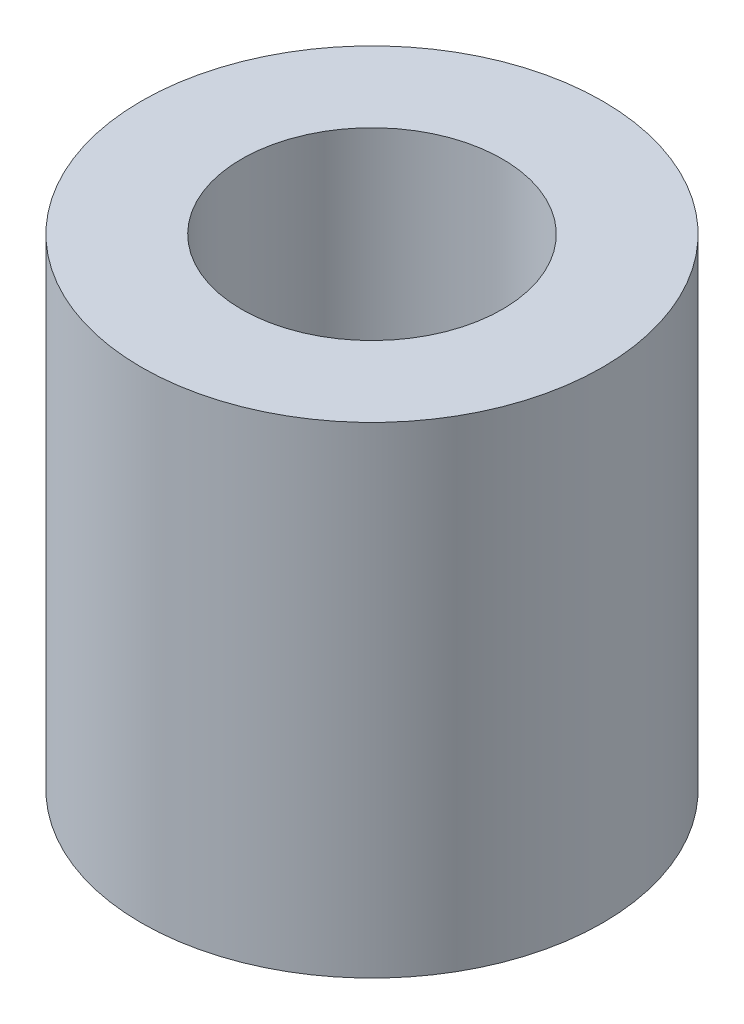
ISO-10303-21;
HEADER;
FILE_DESCRIPTION(('STEP AP214'),'2;1');
FILE_NAME('part.step','',(''),(''),'','','');
FILE_SCHEMA(('AUTOMOTIVE_DESIGN { 1 0 10303 214 1 1 1 1 }'));
ENDSEC;
DATA;
#1=APPLICATION_CONTEXT('core data for automotive mechanical design processes');
#2=APPLICATION_PROTOCOL_DEFINITION('international standard','automotive_design',2000,#1);
#3=PRODUCT_CONTEXT('',#1,'mechanical');
#4=PRODUCT('Part','Part','',(#3));
#5=PRODUCT_RELATED_PRODUCT_CATEGORY('part','',(#4));
#6=PRODUCT_DEFINITION_FORMATION('','',#4);
#7=PRODUCT_DEFINITION_CONTEXT('part definition',#1,'design');
#8=PRODUCT_DEFINITION('design','',#6,#7);
#9=PRODUCT_DEFINITION_SHAPE('','',#8);
#10=(LENGTH_UNIT() NAMED_UNIT(*) SI_UNIT(.MILLI.,.METRE.));
#11=(NAMED_UNIT(*) PLANE_ANGLE_UNIT() SI_UNIT($,.RADIAN.));
#12=(NAMED_UNIT(*) SI_UNIT($,.STERADIAN.) SOLID_ANGLE_UNIT());
#13=UNCERTAINTY_MEASURE_WITH_UNIT(LENGTH_MEASURE(1.E-05),#10,'distance_accuracy_value','');
#14=(GEOMETRIC_REPRESENTATION_CONTEXT(3) GLOBAL_UNCERTAINTY_ASSIGNED_CONTEXT((#13)) GLOBAL_UNIT_ASSIGNED_CONTEXT((#10,
#11,#12)) REPRESENTATION_CONTEXT('',''));
#15=CARTESIAN_POINT('',(0.,0.,0.));
#16=DIRECTION('',(0.,0.,1.));
#17=DIRECTION('',(1.,0.,0.));
#18=AXIS2_PLACEMENT_3D('',#15,#16,#17);
#19=CARTESIAN_POINT('',(0.,12.,0.));
#20=DIRECTION('',(0.,1.,0.));
#21=DIRECTION('',(0.,0.,1.));
#22=AXIS2_PLACEMENT_3D('',#19,#20,#21);
#23=PLANE('',#22);
#24=CARTESIAN_POINT('',(0.,12.,0.));
#25=DIRECTION('',(0.,1.,0.));
#26=DIRECTION('',(0.,0.,1.));
#27=AXIS2_PLACEMENT_3D('',#24,#25,#26);
#28=CIRCLE('',#27,5.75);
#29=CARTESIAN_POINT('',(0.,12.,5.75));
#30=VERTEX_POINT('',#29);
#31=EDGE_CURVE('E10',#30,#30,#28,.T.);
#32=ORIENTED_EDGE('',*,*,#31,.T.);
#33=EDGE_LOOP('',(#32));
#34=FACE_BOUND('',#33,.T.);
#35=CARTESIAN_POINT('',(0.,12.,0.));
#36=DIRECTION('',(0.,1.,0.));
#37=DIRECTION('',(0.,0.,1.));
#38=AXIS2_PLACEMENT_3D('',#35,#36,#37);
#39=CIRCLE('',#38,3.25);
#40=CARTESIAN_POINT('',(0.,12.,3.25));
#41=VERTEX_POINT('',#40);
#42=EDGE_CURVE('E42',#41,#41,#39,.T.);
#43=ORIENTED_EDGE('',*,*,#42,.F.);
#44=EDGE_LOOP('',(#43));
#45=FACE_BOUND('',#44,.T.);
#46=ADVANCED_FACE('F31',(#34,#45),#23,.T.);
#47=CARTESIAN_POINT('',(0.,0.,0.));
#48=DIRECTION('',(0.,1.,0.));
#49=DIRECTION('',(0.,0.,1.));
#50=AXIS2_PLACEMENT_3D('',#47,#48,#49);
#51=PLANE('',#50);
#52=CARTESIAN_POINT('',(0.,0.,0.));
#53=DIRECTION('',(0.,1.,0.));
#54=DIRECTION('',(0.,0.,1.));
#55=AXIS2_PLACEMENT_3D('',#52,#53,#54);
#56=CIRCLE('',#55,5.75);
#57=CARTESIAN_POINT('',(0.,0.,5.75));
#58=VERTEX_POINT('',#57);
#59=EDGE_CURVE('E35',#58,#58,#56,.T.);
#60=ORIENTED_EDGE('',*,*,#59,.F.);
#61=EDGE_LOOP('',(#60));
#62=FACE_BOUND('',#61,.T.);
#63=CARTESIAN_POINT('',(0.,0.,0.));
#64=DIRECTION('',(0.,1.,0.));
#65=DIRECTION('',(0.,0.,1.));
#66=AXIS2_PLACEMENT_3D('',#63,#64,#65);
#67=CIRCLE('',#66,3.25);
#68=CARTESIAN_POINT('',(0.,0.,3.25));
#69=VERTEX_POINT('',#68);
#70=EDGE_CURVE('E44',#69,#69,#67,.T.);
#71=ORIENTED_EDGE('',*,*,#70,.T.);
#72=EDGE_LOOP('',(#71));
#73=FACE_BOUND('',#72,.T.);
#74=ADVANCED_FACE('F54',(#62,#73),#51,.F.);
#75=CARTESIAN_POINT('',(0.,12.,0.));
#76=DIRECTION('',(0.,-1.,0.));
#77=DIRECTION('',(0.,0.,-1.));
#78=AXIS2_PLACEMENT_3D('',#75,#76,#77);
#79=CYLINDRICAL_SURFACE('',#78,5.75);
#80=ORIENTED_EDGE('',*,*,#31,.F.);
#81=EDGE_LOOP('',(#80));
#82=FACE_BOUND('',#81,.T.);
#83=ORIENTED_EDGE('',*,*,#59,.T.);
#84=EDGE_LOOP('',(#83));
#85=FACE_BOUND('',#84,.T.);
#86=ADVANCED_FACE('F33',(#82,#85),#79,.T.);
#87=CARTESIAN_POINT('',(0.,12.,0.));
#88=DIRECTION('',(0.,-1.,0.));
#89=DIRECTION('',(0.,0.,-1.));
#90=AXIS2_PLACEMENT_3D('',#87,#88,#89);
#91=CYLINDRICAL_SURFACE('',#90,3.25);
#92=ORIENTED_EDGE('',*,*,#42,.T.);
#93=EDGE_LOOP('',(#92));
#94=FACE_BOUND('',#93,.T.);
#95=ORIENTED_EDGE('',*,*,#70,.F.);
#96=EDGE_LOOP('',(#95));
#97=FACE_BOUND('',#96,.T.);
#98=ADVANCED_FACE('F50',(#94,#97),#91,.F.);
#99=CLOSED_SHELL('',(#46,#74,#86,#98));
#100=MANIFOLD_SOLID_BREP('B2',#99);
#101=ADVANCED_BREP_SHAPE_REPRESENTATION('',(#18,#100),#14);
#102=SHAPE_DEFINITION_REPRESENTATION(#9,#101);
ENDSEC;
END-ISO-10303-21;
